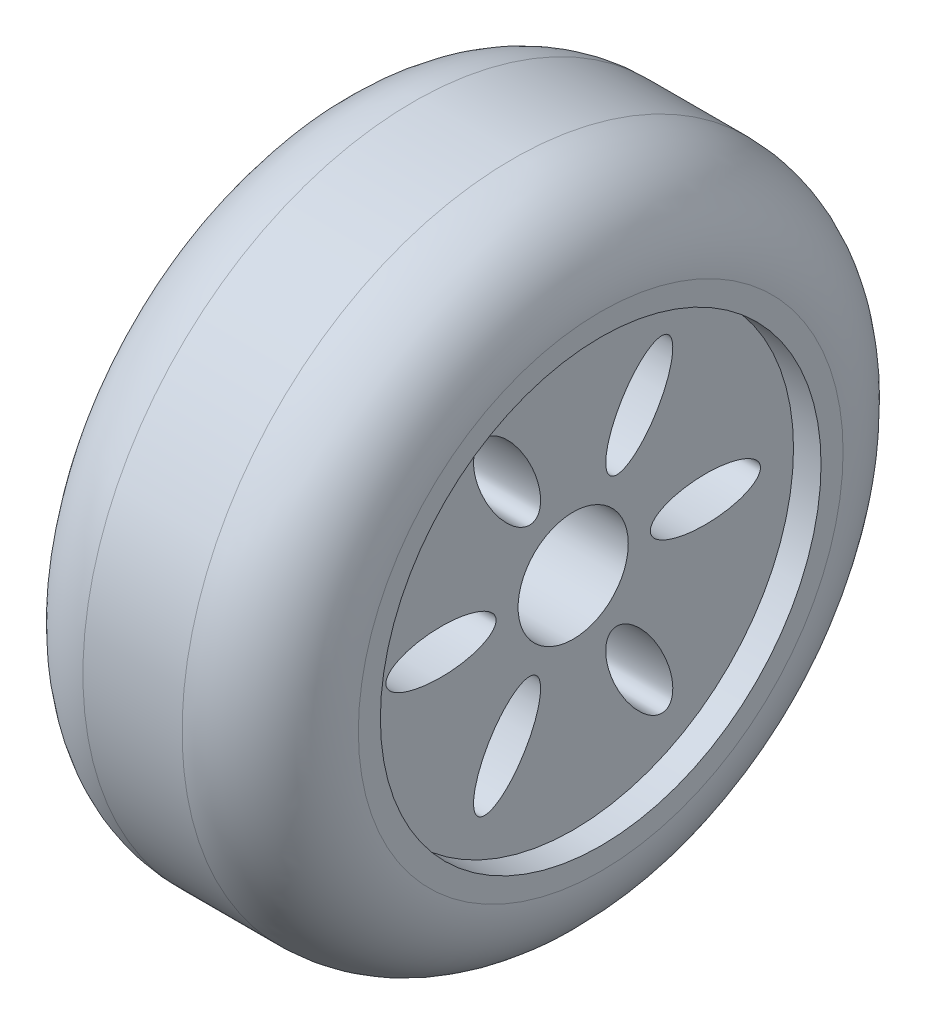
ISO-10303-21;
HEADER;
FILE_DESCRIPTION(('STEP AP214'),'2;1');
FILE_NAME('part.step','',(''),(''),'','','');
FILE_SCHEMA(('AUTOMOTIVE_DESIGN { 1 0 10303 214 1 1 1 1 }'));
ENDSEC;
DATA;
#1=APPLICATION_CONTEXT('core data for automotive mechanical design processes');
#2=APPLICATION_PROTOCOL_DEFINITION('international standard','automotive_design',2000,#1);
#3=PRODUCT_CONTEXT('',#1,'mechanical');
#4=PRODUCT('Part','Part','',(#3));
#5=PRODUCT_RELATED_PRODUCT_CATEGORY('part','',(#4));
#6=PRODUCT_DEFINITION_FORMATION('','',#4);
#7=PRODUCT_DEFINITION_CONTEXT('part definition',#1,'design');
#8=PRODUCT_DEFINITION('design','',#6,#7);
#9=PRODUCT_DEFINITION_SHAPE('','',#8);
#10=(LENGTH_UNIT() NAMED_UNIT(*) SI_UNIT(.MILLI.,.METRE.));
#11=(NAMED_UNIT(*) PLANE_ANGLE_UNIT() SI_UNIT($,.RADIAN.));
#12=(NAMED_UNIT(*) SI_UNIT($,.STERADIAN.) SOLID_ANGLE_UNIT());
#13=UNCERTAINTY_MEASURE_WITH_UNIT(LENGTH_MEASURE(1.E-05),#10,'distance_accuracy_value','');
#14=(GEOMETRIC_REPRESENTATION_CONTEXT(3) GLOBAL_UNCERTAINTY_ASSIGNED_CONTEXT((#13)) GLOBAL_UNIT_ASSIGNED_CONTEXT((#10,
#11,#12)) REPRESENTATION_CONTEXT('',''));
#15=CARTESIAN_POINT('',(0.,0.,0.));
#16=DIRECTION('',(0.,0.,1.));
#17=DIRECTION('',(1.,0.,0.));
#18=AXIS2_PLACEMENT_3D('',#15,#16,#17);
#19=CARTESIAN_POINT('',(10.,0.,0.));
#20=DIRECTION('',(-1.,0.,0.));
#21=DIRECTION('',(0.,0.,1.));
#22=AXIS2_PLACEMENT_3D('',#19,#20,#21);
#23=CYLINDRICAL_SURFACE('',#22,20.);
#24=CARTESIAN_POINT('',(10.,0.,0.));
#25=DIRECTION('',(1.,0.,0.));
#26=DIRECTION('',(0.,0.,-1.));
#27=AXIS2_PLACEMENT_3D('',#24,#25,#26);
#28=CIRCLE('',#27,20.);
#29=CARTESIAN_POINT('',(10.,0.,-20.));
#30=VERTEX_POINT('',#29);
#31=EDGE_CURVE('E52',#30,#30,#28,.T.);
#32=ORIENTED_EDGE('',*,*,#31,.F.);
#33=EDGE_LOOP('',(#32));
#34=FACE_BOUND('',#33,.T.);
#35=CARTESIAN_POINT('',(-10.,0.,0.));
#36=DIRECTION('',(1.,0.,0.));
#37=DIRECTION('',(0.,0.,-1.));
#38=AXIS2_PLACEMENT_3D('',#35,#36,#37);
#39=CIRCLE('',#38,20.);
#40=CARTESIAN_POINT('',(-10.,0.,-20.));
#41=VERTEX_POINT('',#40);
#42=EDGE_CURVE('E78',#41,#41,#39,.T.);
#43=ORIENTED_EDGE('',*,*,#42,.T.);
#44=EDGE_LOOP('',(#43));
#45=FACE_BOUND('',#44,.T.);
#46=ADVANCED_FACE('F43',(#34,#45),#23,.T.);
#47=CARTESIAN_POINT('',(10.,0.,-12.));
#48=DIRECTION('',(1.,0.,0.));
#49=DIRECTION('',(0.,0.,-1.));
#50=AXIS2_PLACEMENT_3D('',#47,#48,#49);
#51=ELLIPSE('',#50,5.,2.);
#52=DIRECTION('',(-1.,0.,0.));
#53=VECTOR('',#52,1.);
#54=SURFACE_OF_LINEAR_EXTRUSION('',#51,#53);
#55=CARTESIAN_POINT('',(10.,-1.18710365520667E-13,-17.));
#56=VERTEX_POINT('',#55);
#57=EDGE_CURVE('E57',#56,#56,#51,.T.);
#58=ORIENTED_EDGE('',*,*,#57,.T.);
#59=EDGE_LOOP('',(#58));
#60=FACE_BOUND('',#59,.T.);
#61=CARTESIAN_POINT('',(-10.,0.,-12.));
#62=DIRECTION('',(1.,0.,0.));
#63=DIRECTION('',(0.,0.,-1.));
#64=AXIS2_PLACEMENT_3D('',#61,#62,#63);
#65=ELLIPSE('',#64,5.,2.);
#66=CARTESIAN_POINT('',(-10.,-1.18710365520667E-13,-17.));
#67=VERTEX_POINT('',#66);
#68=EDGE_CURVE('E76',#67,#67,#65,.T.);
#69=ORIENTED_EDGE('',*,*,#68,.F.);
#70=EDGE_LOOP('',(#69));
#71=FACE_BOUND('',#70,.T.);
#72=ADVANCED_FACE('F121',(#60,#71),#54,.T.);
#73=CARTESIAN_POINT('',(10.,-10.3923048454133,-5.9999999999999));
#74=DIRECTION('',(1.,0.,0.));
#75=DIRECTION('',(0.,-0.866025403784443,-0.499999999999992));
#76=AXIS2_PLACEMENT_3D('',#73,#74,#75);
#77=ELLIPSE('',#76,5.,2.);
#78=DIRECTION('',(-1.,0.,0.));
#79=VECTOR('',#78,1.);
#80=SURFACE_OF_LINEAR_EXTRUSION('',#77,#79);
#81=CARTESIAN_POINT('',(10.,-14.7224318643355,-8.49999999999986));
#82=VERTEX_POINT('',#81);
#83=EDGE_CURVE('E116',#82,#82,#77,.T.);
#84=ORIENTED_EDGE('',*,*,#83,.T.);
#85=EDGE_LOOP('',(#84));
#86=FACE_BOUND('',#85,.T.);
#87=CARTESIAN_POINT('',(-10.,-10.3923048454133,-5.9999999999999));
#88=DIRECTION('',(1.,0.,0.));
#89=DIRECTION('',(0.,-0.866025403784443,-0.499999999999992));
#90=AXIS2_PLACEMENT_3D('',#87,#88,#89);
#91=ELLIPSE('',#90,5.,2.);
#92=CARTESIAN_POINT('',(-10.,-14.7224318643355,-8.49999999999986));
#93=VERTEX_POINT('',#92);
#94=EDGE_CURVE('E73',#93,#93,#91,.T.);
#95=ORIENTED_EDGE('',*,*,#94,.F.);
#96=EDGE_LOOP('',(#95));
#97=FACE_BOUND('',#96,.T.);
#98=ADVANCED_FACE('F109',(#86,#97),#80,.T.);
#99=CARTESIAN_POINT('',(10.,-10.3923048454132,6.00000000000012));
#100=DIRECTION('',(1.,0.,0.));
#101=DIRECTION('',(0.,-0.866025403784433,0.50000000000001));
#102=AXIS2_PLACEMENT_3D('',#99,#100,#101);
#103=ELLIPSE('',#102,5.,2.);
#104=DIRECTION('',(-1.,0.,0.));
#105=VECTOR('',#104,1.);
#106=SURFACE_OF_LINEAR_EXTRUSION('',#103,#105);
#107=CARTESIAN_POINT('',(10.,-14.7224318643354,8.50000000000017));
#108=VERTEX_POINT('',#107);
#109=EDGE_CURVE('E113',#108,#108,#103,.T.);
#110=ORIENTED_EDGE('',*,*,#109,.T.);
#111=EDGE_LOOP('',(#110));
#112=FACE_BOUND('',#111,.T.);
#113=CARTESIAN_POINT('',(-10.,-10.3923048454132,6.00000000000012));
#114=DIRECTION('',(1.,0.,0.));
#115=DIRECTION('',(0.,-0.866025403784433,0.50000000000001));
#116=AXIS2_PLACEMENT_3D('',#113,#114,#115);
#117=ELLIPSE('',#116,5.,2.);
#118=CARTESIAN_POINT('',(-10.,-14.7224318643354,8.50000000000017));
#119=VERTEX_POINT('',#118);
#120=EDGE_CURVE('E70',#119,#119,#117,.T.);
#121=ORIENTED_EDGE('',*,*,#120,.F.);
#122=EDGE_LOOP('',(#121));
#123=FACE_BOUND('',#122,.T.);
#124=ADVANCED_FACE('F105',(#112,#123),#106,.T.);
#125=CARTESIAN_POINT('',(10.,0.,12.));
#126=DIRECTION('',(1.,0.,0.));
#127=DIRECTION('',(0.,0.,1.));
#128=AXIS2_PLACEMENT_3D('',#125,#126,#127);
#129=ELLIPSE('',#128,5.,2.);
#130=DIRECTION('',(-1.,0.,0.));
#131=VECTOR('',#130,1.);
#132=SURFACE_OF_LINEAR_EXTRUSION('',#129,#131);
#133=CARTESIAN_POINT('',(10.,0.,17.));
#134=VERTEX_POINT('',#133);
#135=EDGE_CURVE('E91',#134,#134,#129,.T.);
#136=ORIENTED_EDGE('',*,*,#135,.T.);
#137=EDGE_LOOP('',(#136));
#138=FACE_BOUND('',#137,.T.);
#139=CARTESIAN_POINT('',(-10.,0.,12.));
#140=DIRECTION('',(1.,0.,0.));
#141=DIRECTION('',(0.,0.,1.));
#142=AXIS2_PLACEMENT_3D('',#139,#140,#141);
#143=ELLIPSE('',#142,5.,2.);
#144=CARTESIAN_POINT('',(-10.,0.,17.));
#145=VERTEX_POINT('',#144);
#146=EDGE_CURVE('E67',#145,#145,#143,.T.);
#147=ORIENTED_EDGE('',*,*,#146,.F.);
#148=EDGE_LOOP('',(#147));
#149=FACE_BOUND('',#148,.T.);
#150=ADVANCED_FACE('F101',(#138,#149),#132,.T.);
#151=CARTESIAN_POINT('',(10.,10.3923048454133,5.99999999999998));
#152=DIRECTION('',(1.,0.,0.));
#153=DIRECTION('',(0.,0.86602540378444,0.499999999999998));
#154=AXIS2_PLACEMENT_3D('',#151,#152,#153);
#155=ELLIPSE('',#154,5.,2.);
#156=DIRECTION('',(-1.,0.,0.));
#157=VECTOR('',#156,1.);
#158=SURFACE_OF_LINEAR_EXTRUSION('',#155,#157);
#159=CARTESIAN_POINT('',(10.,14.7224318643355,8.49999999999997));
#160=VERTEX_POINT('',#159);
#161=EDGE_CURVE('E87',#160,#160,#155,.T.);
#162=ORIENTED_EDGE('',*,*,#161,.T.);
#163=EDGE_LOOP('',(#162));
#164=FACE_BOUND('',#163,.T.);
#165=CARTESIAN_POINT('',(-10.,10.3923048454133,5.99999999999998));
#166=DIRECTION('',(1.,0.,0.));
#167=DIRECTION('',(0.,0.86602540378444,0.499999999999998));
#168=AXIS2_PLACEMENT_3D('',#165,#166,#167);
#169=ELLIPSE('',#168,5.,2.);
#170=CARTESIAN_POINT('',(-10.,14.7224318643355,8.49999999999997));
#171=VERTEX_POINT('',#170);
#172=EDGE_CURVE('E64',#171,#171,#169,.T.);
#173=ORIENTED_EDGE('',*,*,#172,.F.);
#174=EDGE_LOOP('',(#173));
#175=FACE_BOUND('',#174,.T.);
#176=ADVANCED_FACE('F98',(#164,#175),#158,.T.);
#177=CARTESIAN_POINT('',(10.,10.3923048454132,-6.00000000000005));
#178=DIRECTION('',(1.,0.,0.));
#179=DIRECTION('',(0.,0.866025403784436,-0.500000000000004));
#180=AXIS2_PLACEMENT_3D('',#177,#178,#179);
#181=ELLIPSE('',#180,5.,2.);
#182=DIRECTION('',(-1.,0.,0.));
#183=VECTOR('',#182,1.);
#184=SURFACE_OF_LINEAR_EXTRUSION('',#181,#183);
#185=CARTESIAN_POINT('',(10.,14.7224318643354,-8.50000000000007));
#186=VERTEX_POINT('',#185);
#187=EDGE_CURVE('E83',#186,#186,#181,.T.);
#188=ORIENTED_EDGE('',*,*,#187,.T.);
#189=EDGE_LOOP('',(#188));
#190=FACE_BOUND('',#189,.T.);
#191=CARTESIAN_POINT('',(-10.,10.3923048454132,-6.00000000000005));
#192=DIRECTION('',(1.,0.,0.));
#193=DIRECTION('',(0.,0.866025403784436,-0.500000000000004));
#194=AXIS2_PLACEMENT_3D('',#191,#192,#193);
#195=ELLIPSE('',#194,5.,2.);
#196=CARTESIAN_POINT('',(-10.,14.7224318643354,-8.50000000000007));
#197=VERTEX_POINT('',#196);
#198=EDGE_CURVE('E61',#197,#197,#195,.T.);
#199=ORIENTED_EDGE('',*,*,#198,.F.);
#200=EDGE_LOOP('',(#199));
#201=FACE_BOUND('',#200,.T.);
#202=ADVANCED_FACE('F45',(#190,#201),#184,.T.);
#203=CARTESIAN_POINT('',(10.,0.,0.));
#204=DIRECTION('',(-1.,0.,0.));
#205=DIRECTION('',(0.,0.,1.));
#206=AXIS2_PLACEMENT_3D('',#203,#204,#205);
#207=CYLINDRICAL_SURFACE('',#206,5.);
#208=CARTESIAN_POINT('',(10.,0.,0.));
#209=DIRECTION('',(1.,0.,0.));
#210=DIRECTION('',(0.,0.,-1.));
#211=AXIS2_PLACEMENT_3D('',#208,#209,#210);
#212=CIRCLE('',#211,5.);
#213=CARTESIAN_POINT('',(10.,0.,-5.));
#214=VERTEX_POINT('',#213);
#215=EDGE_CURVE('E11',#214,#214,#212,.T.);
#216=ORIENTED_EDGE('',*,*,#215,.T.);
#217=EDGE_LOOP('',(#216));
#218=FACE_BOUND('',#217,.T.);
#219=CARTESIAN_POINT('',(-10.,0.,0.));
#220=DIRECTION('',(1.,0.,0.));
#221=DIRECTION('',(0.,0.,-1.));
#222=AXIS2_PLACEMENT_3D('',#219,#220,#221);
#223=CIRCLE('',#222,5.);
#224=CARTESIAN_POINT('',(-10.,0.,-5.));
#225=VERTEX_POINT('',#224);
#226=EDGE_CURVE('E48',#225,#225,#223,.T.);
#227=ORIENTED_EDGE('',*,*,#226,.F.);
#228=EDGE_LOOP('',(#227));
#229=FACE_BOUND('',#228,.T.);
#230=ADVANCED_FACE('F128',(#218,#229),#207,.F.);
#231=CARTESIAN_POINT('',(10.,0.,0.));
#232=DIRECTION('',(1.,0.,0.));
#233=DIRECTION('',(0.,0.,-1.));
#234=AXIS2_PLACEMENT_3D('',#231,#232,#233);
#235=PLANE('',#234);
#236=ORIENTED_EDGE('',*,*,#187,.F.);
#237=EDGE_LOOP('',(#236));
#238=FACE_BOUND('',#237,.T.);
#239=ORIENTED_EDGE('',*,*,#161,.F.);
#240=EDGE_LOOP('',(#239));
#241=FACE_BOUND('',#240,.T.);
#242=ORIENTED_EDGE('',*,*,#135,.F.);
#243=EDGE_LOOP('',(#242));
#244=FACE_BOUND('',#243,.T.);
#245=ORIENTED_EDGE('',*,*,#109,.F.);
#246=EDGE_LOOP('',(#245));
#247=FACE_BOUND('',#246,.T.);
#248=ORIENTED_EDGE('',*,*,#83,.F.);
#249=EDGE_LOOP('',(#248));
#250=FACE_BOUND('',#249,.T.);
#251=ORIENTED_EDGE('',*,*,#57,.F.);
#252=EDGE_LOOP('',(#251));
#253=FACE_BOUND('',#252,.T.);
#254=ORIENTED_EDGE('',*,*,#31,.T.);
#255=EDGE_LOOP('',(#254));
#256=FACE_BOUND('',#255,.T.);
#257=ORIENTED_EDGE('',*,*,#215,.F.);
#258=EDGE_LOOP('',(#257));
#259=FACE_BOUND('',#258,.T.);
#260=ADVANCED_FACE('F131',(#238,#241,#244,#247,#250,#253,#256,#259),#235,.T.);
#261=CARTESIAN_POINT('',(-10.,0.,0.));
#262=DIRECTION('',(1.,0.,0.));
#263=DIRECTION('',(0.,0.,-1.));
#264=AXIS2_PLACEMENT_3D('',#261,#262,#263);
#265=PLANE('',#264);
#266=ORIENTED_EDGE('',*,*,#198,.T.);
#267=EDGE_LOOP('',(#266));
#268=FACE_BOUND('',#267,.T.);
#269=ORIENTED_EDGE('',*,*,#172,.T.);
#270=EDGE_LOOP('',(#269));
#271=FACE_BOUND('',#270,.T.);
#272=ORIENTED_EDGE('',*,*,#146,.T.);
#273=EDGE_LOOP('',(#272));
#274=FACE_BOUND('',#273,.T.);
#275=ORIENTED_EDGE('',*,*,#120,.T.);
#276=EDGE_LOOP('',(#275));
#277=FACE_BOUND('',#276,.T.);
#278=ORIENTED_EDGE('',*,*,#94,.T.);
#279=EDGE_LOOP('',(#278));
#280=FACE_BOUND('',#279,.T.);
#281=ORIENTED_EDGE('',*,*,#68,.T.);
#282=EDGE_LOOP('',(#281));
#283=FACE_BOUND('',#282,.T.);
#284=ORIENTED_EDGE('',*,*,#42,.F.);
#285=EDGE_LOOP('',(#284));
#286=FACE_BOUND('',#285,.T.);
#287=ORIENTED_EDGE('',*,*,#226,.T.);
#288=EDGE_LOOP('',(#287));
#289=FACE_BOUND('',#288,.T.);
#290=ADVANCED_FACE('F132',(#268,#271,#274,#277,#280,#283,#286,#289),#265,.F.);
#291=CLOSED_SHELL('',(#46,#72,#98,#124,#150,#176,#202,#230,#260,#290));
#292=MANIFOLD_SOLID_BREP('B2',#291);
#293=CARTESIAN_POINT('',(12.5,0.,0.));
#294=DIRECTION('',(1.,0.,0.));
#295=DIRECTION('',(0.,0.,-1.));
#296=AXIS2_PLACEMENT_3D('',#293,#294,#295);
#297=PLANE('',#296);
#298=CARTESIAN_POINT('',(12.5,0.,0.));
#299=DIRECTION('',(1.,0.,0.));
#300=DIRECTION('',(0.,0.,-1.));
#301=AXIS2_PLACEMENT_3D('',#298,#299,#300);
#302=CIRCLE('',#301,22.);
#303=CARTESIAN_POINT('',(12.5,0.,-22.));
#304=VERTEX_POINT('',#303);
#305=EDGE_CURVE('E42',#304,#304,#302,.T.);
#306=ORIENTED_EDGE('',*,*,#305,.T.);
#307=EDGE_LOOP('',(#306));
#308=FACE_BOUND('',#307,.T.);
#309=CARTESIAN_POINT('',(12.5,0.,0.));
#310=DIRECTION('',(1.,0.,0.));
#311=DIRECTION('',(0.,0.,-1.));
#312=AXIS2_PLACEMENT_3D('',#309,#310,#311);
#313=CIRCLE('',#312,20.);
#314=CARTESIAN_POINT('',(12.5,0.,-20.));
#315=VERTEX_POINT('',#314);
#316=EDGE_CURVE('E263',#315,#315,#313,.T.);
#317=ORIENTED_EDGE('',*,*,#316,.F.);
#318=EDGE_LOOP('',(#317));
#319=FACE_BOUND('',#318,.T.);
#320=ADVANCED_FACE('F243',(#308,#319),#297,.T.);
#321=CARTESIAN_POINT('',(-12.5,0.,0.));
#322=DIRECTION('',(1.,0.,0.));
#323=DIRECTION('',(0.,0.,-1.));
#324=AXIS2_PLACEMENT_3D('',#321,#322,#323);
#325=PLANE('',#324);
#326=CARTESIAN_POINT('',(-12.5,0.,0.));
#327=DIRECTION('',(1.,0.,0.));
#328=DIRECTION('',(0.,0.,-1.));
#329=AXIS2_PLACEMENT_3D('',#326,#327,#328);
#330=CIRCLE('',#329,22.);
#331=CARTESIAN_POINT('',(-12.5,0.,-22.));
#332=VERTEX_POINT('',#331);
#333=EDGE_CURVE('E250',#332,#332,#330,.F.);
#334=ORIENTED_EDGE('',*,*,#333,.T.);
#335=EDGE_LOOP('',(#334));
#336=FACE_BOUND('',#335,.T.);
#337=CARTESIAN_POINT('',(-12.5,0.,0.));
#338=DIRECTION('',(1.,0.,0.));
#339=DIRECTION('',(0.,0.,-1.));
#340=AXIS2_PLACEMENT_3D('',#337,#338,#339);
#341=CIRCLE('',#340,20.);
#342=CARTESIAN_POINT('',(-12.5,0.,-20.));
#343=VERTEX_POINT('',#342);
#344=EDGE_CURVE('E264',#343,#343,#341,.T.);
#345=ORIENTED_EDGE('',*,*,#344,.T.);
#346=EDGE_LOOP('',(#345));
#347=FACE_BOUND('',#346,.T.);
#348=ADVANCED_FACE('F274',(#336,#347),#325,.F.);
#349=CARTESIAN_POINT('',(12.5,0.,0.));
#350=DIRECTION('',(-1.,0.,0.));
#351=DIRECTION('',(0.,0.,1.));
#352=AXIS2_PLACEMENT_3D('',#349,#350,#351);
#353=CYLINDRICAL_SURFACE('',#352,30.);
#354=CARTESIAN_POINT('',(-4.5,0.,0.));
#355=DIRECTION('',(1.,0.,0.));
#356=DIRECTION('',(0.,0.,-1.));
#357=AXIS2_PLACEMENT_3D('',#354,#355,#356);
#358=CIRCLE('',#357,30.);
#359=CARTESIAN_POINT('',(-4.5,0.,-30.));
#360=VERTEX_POINT('',#359);
#361=EDGE_CURVE('E254',#360,#360,#358,.T.);
#362=ORIENTED_EDGE('',*,*,#361,.T.);
#363=EDGE_LOOP('',(#362));
#364=FACE_BOUND('',#363,.T.);
#365=CARTESIAN_POINT('',(4.5,0.,0.));
#366=DIRECTION('',(1.,0.,0.));
#367=DIRECTION('',(0.,0.,-1.));
#368=AXIS2_PLACEMENT_3D('',#365,#366,#367);
#369=CIRCLE('',#368,30.);
#370=CARTESIAN_POINT('',(4.5,0.,-30.));
#371=VERTEX_POINT('',#370);
#372=EDGE_CURVE('E258',#371,#371,#369,.F.);
#373=ORIENTED_EDGE('',*,*,#372,.T.);
#374=EDGE_LOOP('',(#373));
#375=FACE_BOUND('',#374,.T.);
#376=ADVANCED_FACE('F279',(#364,#375),#353,.T.);
#377=CARTESIAN_POINT('',(12.5,0.,0.));
#378=DIRECTION('',(-1.,0.,0.));
#379=DIRECTION('',(0.,0.,1.));
#380=AXIS2_PLACEMENT_3D('',#377,#378,#379);
#381=CYLINDRICAL_SURFACE('',#380,20.);
#382=ORIENTED_EDGE('',*,*,#316,.T.);
#383=EDGE_LOOP('',(#382));
#384=FACE_BOUND('',#383,.T.);
#385=ORIENTED_EDGE('',*,*,#344,.F.);
#386=EDGE_LOOP('',(#385));
#387=FACE_BOUND('',#386,.T.);
#388=ADVANCED_FACE('F270',(#384,#387),#381,.F.);
#389=CARTESIAN_POINT('',(-4.5,0.,0.));
#390=DIRECTION('',(1.,0.,0.));
#391=DIRECTION('',(0.,0.,-1.));
#392=AXIS2_PLACEMENT_3D('',#389,#390,#391);
#393=TOROIDAL_SURFACE('',#392,22.,8.);
#394=ORIENTED_EDGE('',*,*,#333,.F.);
#395=EDGE_LOOP('',(#394));
#396=FACE_BOUND('',#395,.T.);
#397=ORIENTED_EDGE('',*,*,#361,.F.);
#398=EDGE_LOOP('',(#397));
#399=FACE_BOUND('',#398,.T.);
#400=ADVANCED_FACE('F285',(#396,#399),#393,.T.);
#401=CARTESIAN_POINT('',(4.5,0.,0.));
#402=DIRECTION('',(1.,0.,0.));
#403=DIRECTION('',(0.,0.,-1.));
#404=AXIS2_PLACEMENT_3D('',#401,#402,#403);
#405=TOROIDAL_SURFACE('',#404,22.,8.);
#406=ORIENTED_EDGE('',*,*,#372,.F.);
#407=EDGE_LOOP('',(#406));
#408=FACE_BOUND('',#407,.T.);
#409=ORIENTED_EDGE('',*,*,#305,.F.);
#410=EDGE_LOOP('',(#409));
#411=FACE_BOUND('',#410,.T.);
#412=ADVANCED_FACE('F245',(#408,#411),#405,.T.);
#413=CLOSED_SHELL('',(#320,#348,#376,#388,#400,#412));
#414=MANIFOLD_SOLID_BREP('B6',#413);
#415=ADVANCED_BREP_SHAPE_REPRESENTATION('',(#18,#292,#414),#14);
#416=SHAPE_DEFINITION_REPRESENTATION(#9,#415);
ENDSEC;
END-ISO-10303-21;
